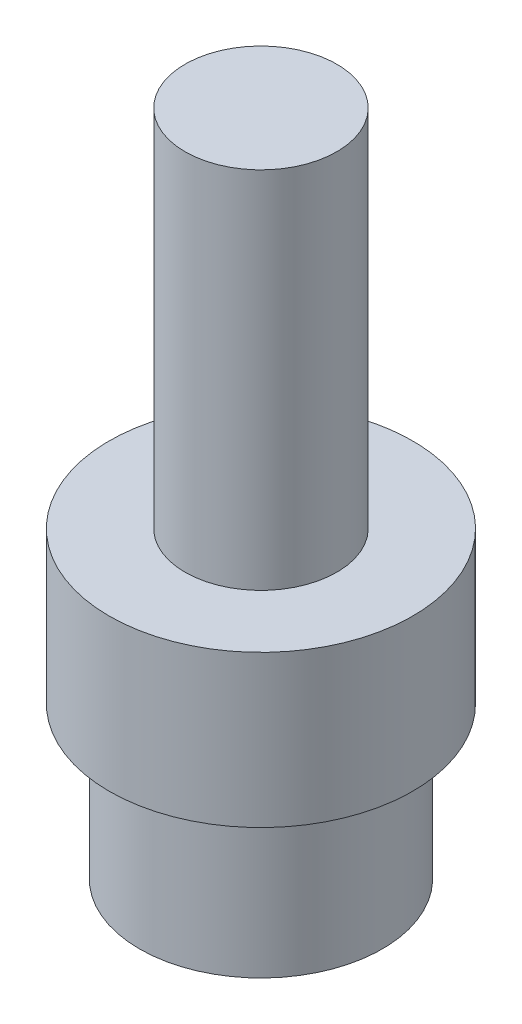
ISO-10303-21;
HEADER;
FILE_DESCRIPTION(('STEP AP214'),'2;1');
FILE_NAME('part.step','',(''),(''),'','','');
FILE_SCHEMA(('AUTOMOTIVE_DESIGN { 1 0 10303 214 1 1 1 1 }'));
ENDSEC;
DATA;
#1=APPLICATION_CONTEXT('core data for automotive mechanical design processes');
#2=APPLICATION_PROTOCOL_DEFINITION('international standard','automotive_design',2000,#1);
#3=PRODUCT_CONTEXT('',#1,'mechanical');
#4=PRODUCT('Part','Part','',(#3));
#5=PRODUCT_RELATED_PRODUCT_CATEGORY('part','',(#4));
#6=PRODUCT_DEFINITION_FORMATION('','',#4);
#7=PRODUCT_DEFINITION_CONTEXT('part definition',#1,'design');
#8=PRODUCT_DEFINITION('design','',#6,#7);
#9=PRODUCT_DEFINITION_SHAPE('','',#8);
#10=(LENGTH_UNIT() NAMED_UNIT(*) SI_UNIT(.MILLI.,.METRE.));
#11=(NAMED_UNIT(*) PLANE_ANGLE_UNIT() SI_UNIT($,.RADIAN.));
#12=(NAMED_UNIT(*) SI_UNIT($,.STERADIAN.) SOLID_ANGLE_UNIT());
#13=UNCERTAINTY_MEASURE_WITH_UNIT(LENGTH_MEASURE(1.E-05),#10,'distance_accuracy_value','');
#14=(GEOMETRIC_REPRESENTATION_CONTEXT(3) GLOBAL_UNCERTAINTY_ASSIGNED_CONTEXT((#13)) GLOBAL_UNIT_ASSIGNED_CONTEXT((#10,
#11,#12)) REPRESENTATION_CONTEXT('',''));
#15=CARTESIAN_POINT('',(0.,0.,0.));
#16=DIRECTION('',(0.,0.,1.));
#17=DIRECTION('',(1.,0.,0.));
#18=AXIS2_PLACEMENT_3D('',#15,#16,#17);
#19=CARTESIAN_POINT('',(0.,5.,0.));
#20=DIRECTION('',(0.,-1.,0.));
#21=DIRECTION('',(0.,0.,-1.));
#22=AXIS2_PLACEMENT_3D('',#19,#20,#21);
#23=CYLINDRICAL_SURFACE('',#22,5.);
#24=CARTESIAN_POINT('',(0.,5.,0.));
#25=DIRECTION('',(0.,1.,0.));
#26=DIRECTION('',(0.,0.,1.));
#27=AXIS2_PLACEMENT_3D('',#24,#25,#26);
#28=CIRCLE('',#27,5.);
#29=CARTESIAN_POINT('',(0.,5.,5.));
#30=VERTEX_POINT('',#29);
#31=EDGE_CURVE('E49',#30,#30,#28,.T.);
#32=ORIENTED_EDGE('',*,*,#31,.F.);
#33=EDGE_LOOP('',(#32));
#34=FACE_BOUND('',#33,.T.);
#35=CARTESIAN_POINT('',(0.,0.,0.));
#36=DIRECTION('',(0.,1.,0.));
#37=DIRECTION('',(0.,0.,1.));
#38=AXIS2_PLACEMENT_3D('',#35,#36,#37);
#39=CIRCLE('',#38,5.);
#40=CARTESIAN_POINT('',(0.,0.,5.));
#41=VERTEX_POINT('',#40);
#42=EDGE_CURVE('E40',#41,#41,#39,.T.);
#43=ORIENTED_EDGE('',*,*,#42,.T.);
#44=EDGE_LOOP('',(#43));
#45=FACE_BOUND('',#44,.T.);
#46=ADVANCED_FACE('F37',(#34,#45),#23,.T.);
#47=CARTESIAN_POINT('',(0.,5.,0.));
#48=DIRECTION('',(0.,1.,0.));
#49=DIRECTION('',(0.,0.,1.));
#50=AXIS2_PLACEMENT_3D('',#47,#48,#49);
#51=PLANE('',#50);
#52=CARTESIAN_POINT('',(0.,5.,0.));
#53=DIRECTION('',(0.,1.,0.));
#54=DIRECTION('',(0.,0.,1.));
#55=AXIS2_PLACEMENT_3D('',#52,#53,#54);
#56=CIRCLE('',#55,2.5);
#57=CARTESIAN_POINT('',(0.,5.,2.5));
#58=VERTEX_POINT('',#57);
#59=EDGE_CURVE('E10',#58,#58,#56,.T.);
#60=ORIENTED_EDGE('',*,*,#59,.F.);
#61=EDGE_LOOP('',(#60));
#62=FACE_BOUND('',#61,.T.);
#63=ORIENTED_EDGE('',*,*,#31,.T.);
#64=EDGE_LOOP('',(#63));
#65=FACE_BOUND('',#64,.T.);
#66=ADVANCED_FACE('F66',(#62,#65),#51,.T.);
#67=CARTESIAN_POINT('',(0.,0.,0.));
#68=DIRECTION('',(0.,1.,0.));
#69=DIRECTION('',(0.,0.,1.));
#70=AXIS2_PLACEMENT_3D('',#67,#68,#69);
#71=PLANE('',#70);
#72=CARTESIAN_POINT('',(0.,0.,0.));
#73=DIRECTION('',(0.,-1.,0.));
#74=DIRECTION('',(0.,0.,-1.));
#75=AXIS2_PLACEMENT_3D('',#72,#73,#74);
#76=CIRCLE('',#75,4.);
#77=CARTESIAN_POINT('',(0.,0.,-4.));
#78=VERTEX_POINT('',#77);
#79=EDGE_CURVE('E44',#78,#78,#76,.T.);
#80=ORIENTED_EDGE('',*,*,#79,.F.);
#81=EDGE_LOOP('',(#80));
#82=FACE_BOUND('',#81,.T.);
#83=ORIENTED_EDGE('',*,*,#42,.F.);
#84=EDGE_LOOP('',(#83));
#85=FACE_BOUND('',#84,.T.);
#86=ADVANCED_FACE('F63',(#82,#85),#71,.F.);
#87=CARTESIAN_POINT('',(0.,-5.,0.));
#88=DIRECTION('',(0.,1.,0.));
#89=DIRECTION('',(0.,0.,1.));
#90=AXIS2_PLACEMENT_3D('',#87,#88,#89);
#91=CYLINDRICAL_SURFACE('',#90,4.);
#92=CARTESIAN_POINT('',(0.,-5.,0.));
#93=DIRECTION('',(0.,-1.,0.));
#94=DIRECTION('',(0.,0.,-1.));
#95=AXIS2_PLACEMENT_3D('',#92,#93,#94);
#96=CIRCLE('',#95,4.);
#97=CARTESIAN_POINT('',(0.,-5.,-4.));
#98=VERTEX_POINT('',#97);
#99=EDGE_CURVE('E54',#98,#98,#96,.T.);
#100=ORIENTED_EDGE('',*,*,#99,.F.);
#101=EDGE_LOOP('',(#100));
#102=FACE_BOUND('',#101,.T.);
#103=ORIENTED_EDGE('',*,*,#79,.T.);
#104=EDGE_LOOP('',(#103));
#105=FACE_BOUND('',#104,.T.);
#106=ADVANCED_FACE('F65',(#102,#105),#91,.T.);
#107=CARTESIAN_POINT('',(0.,-5.,0.));
#108=DIRECTION('',(0.,-1.,0.));
#109=DIRECTION('',(0.,0.,-1.));
#110=AXIS2_PLACEMENT_3D('',#107,#108,#109);
#111=PLANE('',#110);
#112=ORIENTED_EDGE('',*,*,#99,.T.);
#113=EDGE_LOOP('',(#112));
#114=FACE_BOUND('',#113,.T.);
#115=ADVANCED_FACE('F72',(#114),#111,.T.);
#116=CARTESIAN_POINT('',(0.,17.,0.));
#117=DIRECTION('',(0.,-1.,0.));
#118=DIRECTION('',(0.,0.,-1.));
#119=AXIS2_PLACEMENT_3D('',#116,#117,#118);
#120=CYLINDRICAL_SURFACE('',#119,2.5);
#121=CARTESIAN_POINT('',(0.,17.,0.));
#122=DIRECTION('',(0.,1.,0.));
#123=DIRECTION('',(0.,0.,1.));
#124=AXIS2_PLACEMENT_3D('',#121,#122,#123);
#125=CIRCLE('',#124,2.5);
#126=CARTESIAN_POINT('',(0.,17.,2.5));
#127=VERTEX_POINT('',#126);
#128=EDGE_CURVE('E53',#127,#127,#125,.T.);
#129=ORIENTED_EDGE('',*,*,#128,.F.);
#130=EDGE_LOOP('',(#129));
#131=FACE_BOUND('',#130,.T.);
#132=ORIENTED_EDGE('',*,*,#59,.T.);
#133=EDGE_LOOP('',(#132));
#134=FACE_BOUND('',#133,.T.);
#135=ADVANCED_FACE('F109',(#131,#134),#120,.T.);
#136=CARTESIAN_POINT('',(0.,17.,0.));
#137=DIRECTION('',(0.,1.,0.));
#138=DIRECTION('',(0.,0.,1.));
#139=AXIS2_PLACEMENT_3D('',#136,#137,#138);
#140=PLANE('',#139);
#141=ORIENTED_EDGE('',*,*,#128,.T.);
#142=EDGE_LOOP('',(#141));
#143=FACE_BOUND('',#142,.T.);
#144=ADVANCED_FACE('F118',(#143),#140,.T.);
#145=CLOSED_SHELL('',(#46,#66,#86,#106,#115,#135,#144));
#146=MANIFOLD_SOLID_BREP('B2',#145);
#147=ADVANCED_BREP_SHAPE_REPRESENTATION('',(#18,#146),#14);
#148=SHAPE_DEFINITION_REPRESENTATION(#9,#147);
ENDSEC;
END-ISO-10303-21;
